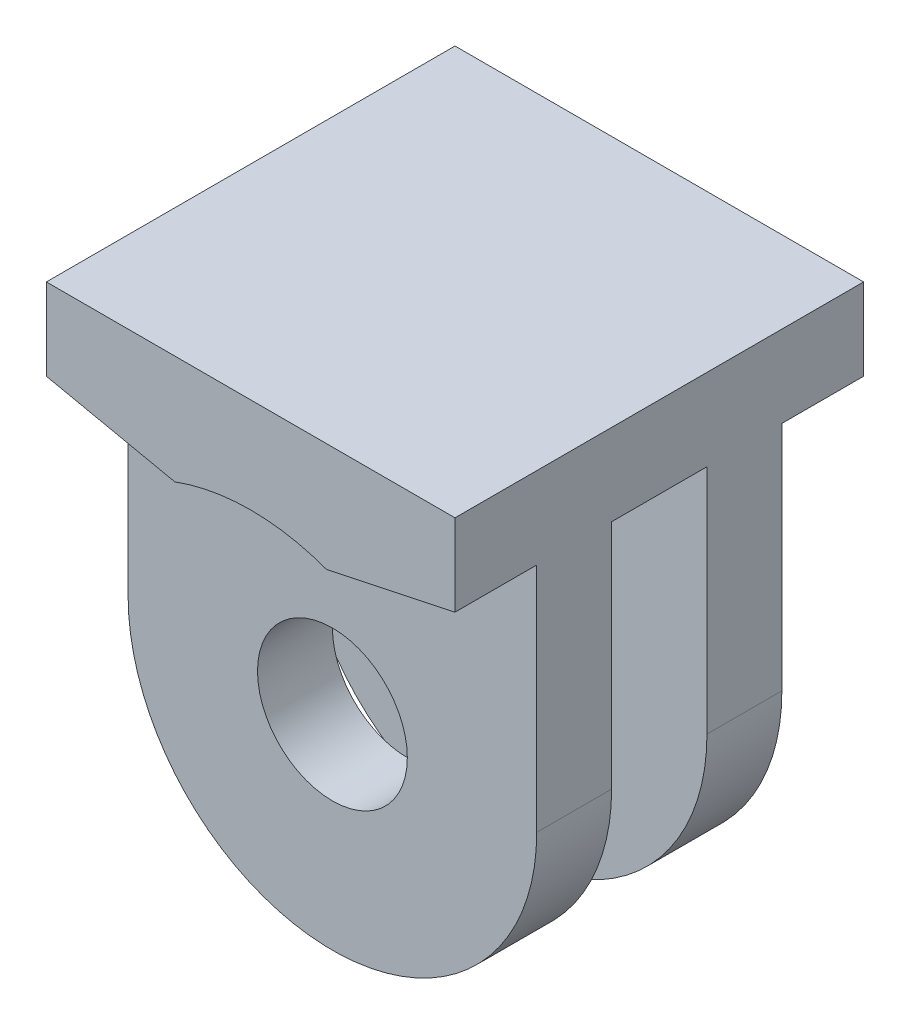
ISO-10303-21;
HEADER;
FILE_DESCRIPTION(('STEP AP214'),'2;1');
FILE_NAME('part.step','',(''),(''),'','','');
FILE_SCHEMA(('AUTOMOTIVE_DESIGN { 1 0 10303 214 1 1 1 1 }'));
ENDSEC;
DATA;
#1=APPLICATION_CONTEXT('core data for automotive mechanical design processes');
#2=APPLICATION_PROTOCOL_DEFINITION('international standard','automotive_design',2000,#1);
#3=PRODUCT_CONTEXT('',#1,'mechanical');
#4=PRODUCT('Part','Part','',(#3));
#5=PRODUCT_RELATED_PRODUCT_CATEGORY('part','',(#4));
#6=PRODUCT_DEFINITION_FORMATION('','',#4);
#7=PRODUCT_DEFINITION_CONTEXT('part definition',#1,'design');
#8=PRODUCT_DEFINITION('design','',#6,#7);
#9=PRODUCT_DEFINITION_SHAPE('','',#8);
#10=(LENGTH_UNIT() NAMED_UNIT(*) SI_UNIT(.MILLI.,.METRE.));
#11=(NAMED_UNIT(*) PLANE_ANGLE_UNIT() SI_UNIT($,.RADIAN.));
#12=(NAMED_UNIT(*) SI_UNIT($,.STERADIAN.) SOLID_ANGLE_UNIT());
#13=UNCERTAINTY_MEASURE_WITH_UNIT(LENGTH_MEASURE(1.E-05),#10,'distance_accuracy_value','');
#14=(GEOMETRIC_REPRESENTATION_CONTEXT(3) GLOBAL_UNCERTAINTY_ASSIGNED_CONTEXT((#13)) GLOBAL_UNIT_ASSIGNED_CONTEXT((#10,
#11,#12)) REPRESENTATION_CONTEXT('',''));
#15=CARTESIAN_POINT('',(0.,0.,0.));
#16=DIRECTION('',(0.,0.,1.));
#17=DIRECTION('',(1.,0.,0.));
#18=AXIS2_PLACEMENT_3D('',#15,#16,#17);
#19=CARTESIAN_POINT('',(15.,4.,0.));
#20=DIRECTION('',(-1.,0.,0.));
#21=DIRECTION('',(0.,0.,1.));
#22=AXIS2_PLACEMENT_3D('',#19,#20,#21);
#23=PLANE('',#22);
#24=DIRECTION('',(0.,0.,1.));
#25=VECTOR('',#24,1.);
#26=CARTESIAN_POINT('',(15.,1.,-6.57097161148817));
#27=LINE('',#26,#25);
#28=CARTESIAN_POINT('',(15.,1.,-1.75));
#29=VERTEX_POINT('',#28);
#30=CARTESIAN_POINT('',(15.,1.,1.75));
#31=VERTEX_POINT('',#30);
#32=EDGE_CURVE('E210',#29,#31,#27,.T.);
#33=ORIENTED_EDGE('',*,*,#32,.F.);
#34=DIRECTION('',(0.,1.,0.));
#35=VECTOR('',#34,1.);
#36=CARTESIAN_POINT('',(15.,-15.,-1.75));
#37=LINE('',#36,#35);
#38=CARTESIAN_POINT('',(15.,-7.5,-1.75));
#39=VERTEX_POINT('',#38);
#40=EDGE_CURVE('E265',#39,#29,#37,.T.);
#41=ORIENTED_EDGE('',*,*,#40,.F.);
#42=DIRECTION('',(0.,0.,-1.));
#43=VECTOR('',#42,1.);
#44=CARTESIAN_POINT('',(15.,-7.5,0.));
#45=LINE('',#44,#43);
#46=CARTESIAN_POINT('',(15.,-7.5,-4.5));
#47=VERTEX_POINT('',#46);
#48=EDGE_CURVE('E258',#39,#47,#45,.T.);
#49=ORIENTED_EDGE('',*,*,#48,.T.);
#50=DIRECTION('',(0.,1.,0.));
#51=VECTOR('',#50,1.);
#52=CARTESIAN_POINT('',(15.,-15.,-4.5));
#53=LINE('',#52,#51);
#54=CARTESIAN_POINT('',(15.,1.,-4.5));
#55=VERTEX_POINT('',#54);
#56=EDGE_CURVE('E267',#47,#55,#53,.T.);
#57=ORIENTED_EDGE('',*,*,#56,.T.);
#58=DIRECTION('',(0.,0.,-1.));
#59=VECTOR('',#58,1.);
#60=CARTESIAN_POINT('',(15.,1.,0.320971611488171));
#61=LINE('',#60,#59);
#62=CARTESIAN_POINT('',(15.,1.,-7.5));
#63=VERTEX_POINT('',#62);
#64=EDGE_CURVE('E227',#55,#63,#61,.T.);
#65=ORIENTED_EDGE('',*,*,#64,.T.);
#66=DIRECTION('',(0.,-1.,0.));
#67=VECTOR('',#66,1.);
#68=CARTESIAN_POINT('',(15.,4.,-7.5));
#69=LINE('',#68,#67);
#70=CARTESIAN_POINT('',(15.,4.,-7.5));
#71=VERTEX_POINT('',#70);
#72=EDGE_CURVE('E11',#71,#63,#69,.T.);
#73=ORIENTED_EDGE('',*,*,#72,.F.);
#74=DIRECTION('',(0.,0.,-1.));
#75=VECTOR('',#74,1.);
#76=CARTESIAN_POINT('',(15.,4.,0.));
#77=LINE('',#76,#75);
#78=CARTESIAN_POINT('',(15.,4.,7.5));
#79=VERTEX_POINT('',#78);
#80=EDGE_CURVE('E273',#79,#71,#77,.T.);
#81=ORIENTED_EDGE('',*,*,#80,.F.);
#82=DIRECTION('',(0.,-1.,0.));
#83=VECTOR('',#82,1.);
#84=CARTESIAN_POINT('',(15.,4.,7.5));
#85=LINE('',#84,#83);
#86=CARTESIAN_POINT('',(15.,1.,7.5));
#87=VERTEX_POINT('',#86);
#88=EDGE_CURVE('E207',#79,#87,#85,.T.);
#89=ORIENTED_EDGE('',*,*,#88,.T.);
#90=DIRECTION('',(0.,0.,1.));
#91=VECTOR('',#90,1.);
#92=CARTESIAN_POINT('',(15.,1.,-0.320971611488171));
#93=LINE('',#92,#91);
#94=CARTESIAN_POINT('',(15.,1.,4.5));
#95=VERTEX_POINT('',#94);
#96=EDGE_CURVE('E307',#95,#87,#93,.T.);
#97=ORIENTED_EDGE('',*,*,#96,.F.);
#98=DIRECTION('',(0.,1.,0.));
#99=VECTOR('',#98,1.);
#100=CARTESIAN_POINT('',(15.,-15.,4.5));
#101=LINE('',#100,#99);
#102=CARTESIAN_POINT('',(15.,-7.5,4.5));
#103=VERTEX_POINT('',#102);
#104=EDGE_CURVE('E190',#103,#95,#101,.T.);
#105=ORIENTED_EDGE('',*,*,#104,.F.);
#106=DIRECTION('',(0.,0.,1.));
#107=VECTOR('',#106,1.);
#108=CARTESIAN_POINT('',(15.,-7.5,0.));
#109=LINE('',#108,#107);
#110=CARTESIAN_POINT('',(15.,-7.5,1.75));
#111=VERTEX_POINT('',#110);
#112=EDGE_CURVE('E328',#111,#103,#109,.T.);
#113=ORIENTED_EDGE('',*,*,#112,.F.);
#114=DIRECTION('',(0.,1.,0.));
#115=VECTOR('',#114,1.);
#116=CARTESIAN_POINT('',(15.,-15.,1.75));
#117=LINE('',#116,#115);
#118=EDGE_CURVE('E187',#111,#31,#117,.T.);
#119=ORIENTED_EDGE('',*,*,#118,.T.);
#120=EDGE_LOOP('',(#33,#41,#49,#57,#65,#73,#81,#89,#97,#105,#113,#119));
#121=FACE_BOUND('',#120,.T.);
#122=ADVANCED_FACE('F33',(#121),#23,.F.);
#123=CARTESIAN_POINT('',(0.,4.,0.));
#124=DIRECTION('',(1.,0.,0.));
#125=DIRECTION('',(0.,0.,-1.));
#126=AXIS2_PLACEMENT_3D('',#123,#124,#125);
#127=PLANE('',#126);
#128=DIRECTION('',(0.,1.,0.));
#129=VECTOR('',#128,1.);
#130=CARTESIAN_POINT('',(0.,-15.,-1.75));
#131=LINE('',#130,#129);
#132=CARTESIAN_POINT('',(0.,-7.5,-1.75));
#133=VERTEX_POINT('',#132);
#134=CARTESIAN_POINT('',(0.,1.,-1.75));
#135=VERTEX_POINT('',#134);
#136=EDGE_CURVE('E165',#133,#135,#131,.T.);
#137=ORIENTED_EDGE('',*,*,#136,.T.);
#138=DIRECTION('',(0.,0.,1.));
#139=VECTOR('',#138,1.);
#140=CARTESIAN_POINT('',(0.,1.,-6.57097161148817));
#141=LINE('',#140,#139);
#142=CARTESIAN_POINT('',(0.,1.,1.75));
#143=VERTEX_POINT('',#142);
#144=EDGE_CURVE('E159',#135,#143,#141,.T.);
#145=ORIENTED_EDGE('',*,*,#144,.T.);
#146=DIRECTION('',(0.,1.,0.));
#147=VECTOR('',#146,1.);
#148=CARTESIAN_POINT('',(0.,-15.,1.75));
#149=LINE('',#148,#147);
#150=CARTESIAN_POINT('',(0.,-7.5,1.75));
#151=VERTEX_POINT('',#150);
#152=EDGE_CURVE('E163',#151,#143,#149,.T.);
#153=ORIENTED_EDGE('',*,*,#152,.F.);
#154=DIRECTION('',(0.,0.,1.));
#155=VECTOR('',#154,1.);
#156=CARTESIAN_POINT('',(0.,-7.5,0.));
#157=LINE('',#156,#155);
#158=CARTESIAN_POINT('',(0.,-7.5,4.5));
#159=VERTEX_POINT('',#158);
#160=EDGE_CURVE('E192',#151,#159,#157,.T.);
#161=ORIENTED_EDGE('',*,*,#160,.T.);
#162=DIRECTION('',(0.,1.,0.));
#163=VECTOR('',#162,1.);
#164=CARTESIAN_POINT('',(0.,-15.,4.5));
#165=LINE('',#164,#163);
#166=CARTESIAN_POINT('',(0.,1.,4.5));
#167=VERTEX_POINT('',#166);
#168=EDGE_CURVE('E198',#159,#167,#165,.T.);
#169=ORIENTED_EDGE('',*,*,#168,.T.);
#170=DIRECTION('',(0.,0.,1.));
#171=VECTOR('',#170,1.);
#172=CARTESIAN_POINT('',(0.,1.,-0.320971611488171));
#173=LINE('',#172,#171);
#174=CARTESIAN_POINT('',(0.,1.,7.5));
#175=VERTEX_POINT('',#174);
#176=EDGE_CURVE('E316',#167,#175,#173,.T.);
#177=ORIENTED_EDGE('',*,*,#176,.T.);
#178=DIRECTION('',(0.,-1.,0.));
#179=VECTOR('',#178,1.);
#180=CARTESIAN_POINT('',(0.,4.,7.5));
#181=LINE('',#180,#179);
#182=CARTESIAN_POINT('',(0.,4.,7.5));
#183=VERTEX_POINT('',#182);
#184=EDGE_CURVE('E204',#183,#175,#181,.T.);
#185=ORIENTED_EDGE('',*,*,#184,.F.);
#186=DIRECTION('',(0.,0.,1.));
#187=VECTOR('',#186,1.);
#188=CARTESIAN_POINT('',(0.,4.,0.));
#189=LINE('',#188,#187);
#190=CARTESIAN_POINT('',(0.,4.,-7.5));
#191=VERTEX_POINT('',#190);
#192=EDGE_CURVE('E271',#191,#183,#189,.T.);
#193=ORIENTED_EDGE('',*,*,#192,.F.);
#194=DIRECTION('',(0.,-1.,0.));
#195=VECTOR('',#194,1.);
#196=CARTESIAN_POINT('',(0.,4.,-7.5));
#197=LINE('',#196,#195);
#198=CARTESIAN_POINT('',(0.,1.,-7.5));
#199=VERTEX_POINT('',#198);
#200=EDGE_CURVE('E42',#191,#199,#197,.T.);
#201=ORIENTED_EDGE('',*,*,#200,.T.);
#202=DIRECTION('',(0.,0.,-1.));
#203=VECTOR('',#202,1.);
#204=CARTESIAN_POINT('',(0.,1.,0.320971611488171));
#205=LINE('',#204,#203);
#206=CARTESIAN_POINT('',(0.,1.,-4.5));
#207=VERTEX_POINT('',#206);
#208=EDGE_CURVE('E232',#207,#199,#205,.T.);
#209=ORIENTED_EDGE('',*,*,#208,.F.);
#210=DIRECTION('',(0.,1.,0.));
#211=VECTOR('',#210,1.);
#212=CARTESIAN_POINT('',(0.,-15.,-4.5));
#213=LINE('',#212,#211);
#214=CARTESIAN_POINT('',(0.,-7.5,-4.5));
#215=VERTEX_POINT('',#214);
#216=EDGE_CURVE('E269',#215,#207,#213,.T.);
#217=ORIENTED_EDGE('',*,*,#216,.F.);
#218=DIRECTION('',(0.,0.,-1.));
#219=VECTOR('',#218,1.);
#220=CARTESIAN_POINT('',(0.,-7.5,0.));
#221=LINE('',#220,#219);
#222=EDGE_CURVE('E259',#133,#215,#221,.T.);
#223=ORIENTED_EDGE('',*,*,#222,.F.);
#224=EDGE_LOOP('',(#137,#145,#153,#161,#169,#177,#185,#193,#201,#209,#217,#223));
#225=FACE_BOUND('',#224,.T.);
#226=ADVANCED_FACE('F35',(#225),#127,.F.);
#227=CARTESIAN_POINT('',(0.,4.,-7.5));
#228=DIRECTION('',(0.,0.,1.));
#229=DIRECTION('',(1.,0.,0.));
#230=AXIS2_PLACEMENT_3D('',#227,#228,#229);
#231=PLANE('',#230);
#232=ORIENTED_EDGE('',*,*,#72,.T.);
#233=DIRECTION('',(0.97825048530605,0.207427066696896,0.));
#234=VECTOR('',#233,1.);
#235=CARTESIAN_POINT('',(10.283882181415,0.,-7.5));
#236=LINE('',#235,#234);
#237=CARTESIAN_POINT('',(10.283882181415,0.,-7.5));
#238=VERTEX_POINT('',#237);
#239=EDGE_CURVE('E221',#238,#63,#236,.T.);
#240=ORIENTED_EDGE('',*,*,#239,.F.);
#241=CARTESIAN_POINT('',(7.5,-7.5,-7.5));
#242=DIRECTION('',(0.,0.,-1.));
#243=DIRECTION('',(-1.,0.,0.));
#244=AXIS2_PLACEMENT_3D('',#241,#242,#243);
#245=CIRCLE('',#244,8.);
#246=CARTESIAN_POINT('',(4.71611781858499,0.,-7.5));
#247=VERTEX_POINT('',#246);
#248=EDGE_CURVE('E241',#247,#238,#245,.T.);
#249=ORIENTED_EDGE('',*,*,#248,.F.);
#250=DIRECTION('',(0.97825048530605,-0.207427066696896,0.));
#251=VECTOR('',#250,1.);
#252=CARTESIAN_POINT('',(4.71611781858499,0.,-7.5));
#253=LINE('',#252,#251);
#254=EDGE_CURVE('E168',#199,#247,#253,.T.);
#255=ORIENTED_EDGE('',*,*,#254,.F.);
#256=ORIENTED_EDGE('',*,*,#200,.F.);
#257=DIRECTION('',(-1.,0.,0.));
#258=VECTOR('',#257,1.);
#259=CARTESIAN_POINT('',(0.,4.,-7.5));
#260=LINE('',#259,#258);
#261=EDGE_CURVE('E57',#71,#191,#260,.T.);
#262=ORIENTED_EDGE('',*,*,#261,.F.);
#263=EDGE_LOOP('',(#232,#240,#249,#255,#256,#262));
#264=FACE_BOUND('',#263,.T.);
#265=ADVANCED_FACE('F283',(#264),#231,.F.);
#266=CARTESIAN_POINT('',(0.,4.,0.));
#267=DIRECTION('',(0.,-1.,0.));
#268=DIRECTION('',(0.,0.,-1.));
#269=AXIS2_PLACEMENT_3D('',#266,#267,#268);
#270=PLANE('',#269);
#271=ORIENTED_EDGE('',*,*,#192,.T.);
#272=DIRECTION('',(-1.,0.,0.));
#273=VECTOR('',#272,1.);
#274=CARTESIAN_POINT('',(0.,4.,7.5));
#275=LINE('',#274,#273);
#276=EDGE_CURVE('E201',#79,#183,#275,.T.);
#277=ORIENTED_EDGE('',*,*,#276,.F.);
#278=ORIENTED_EDGE('',*,*,#80,.T.);
#279=ORIENTED_EDGE('',*,*,#261,.T.);
#280=EDGE_LOOP('',(#271,#277,#278,#279));
#281=FACE_BOUND('',#280,.T.);
#282=ADVANCED_FACE('F378',(#281),#270,.F.);
#283=CARTESIAN_POINT('',(0.,-15.,-4.5));
#284=DIRECTION('',(0.,0.,1.));
#285=DIRECTION('',(1.,0.,0.));
#286=AXIS2_PLACEMENT_3D('',#283,#284,#285);
#287=PLANE('',#286);
#288=ORIENTED_EDGE('',*,*,#216,.T.);
#289=DIRECTION('',(0.97825048530605,-0.207427066696896,0.));
#290=VECTOR('',#289,1.);
#291=CARTESIAN_POINT('',(4.71611781858499,0.,-4.5));
#292=LINE('',#291,#290);
#293=CARTESIAN_POINT('',(4.71611781858499,0.,-4.5));
#294=VERTEX_POINT('',#293);
#295=EDGE_CURVE('E224',#207,#294,#292,.T.);
#296=ORIENTED_EDGE('',*,*,#295,.T.);
#297=CARTESIAN_POINT('',(7.5,-7.5,-4.5));
#298=DIRECTION('',(0.,0.,1.));
#299=DIRECTION('',(1.,0.,0.));
#300=AXIS2_PLACEMENT_3D('',#297,#298,#299);
#301=CIRCLE('',#300,8.);
#302=CARTESIAN_POINT('',(10.283882181415,0.,-4.5));
#303=VERTEX_POINT('',#302);
#304=EDGE_CURVE('E244',#294,#303,#301,.F.);
#305=ORIENTED_EDGE('',*,*,#304,.T.);
#306=DIRECTION('',(0.97825048530605,0.207427066696896,0.));
#307=VECTOR('',#306,1.);
#308=CARTESIAN_POINT('',(10.283882181415,0.,-4.5));
#309=LINE('',#308,#307);
#310=EDGE_CURVE('E223',#303,#55,#309,.T.);
#311=ORIENTED_EDGE('',*,*,#310,.T.);
#312=ORIENTED_EDGE('',*,*,#56,.F.);
#313=CARTESIAN_POINT('',(7.5,-7.5,-4.5));
#314=DIRECTION('',(0.,0.,1.));
#315=DIRECTION('',(-1.,0.,0.));
#316=AXIS2_PLACEMENT_3D('',#313,#314,#315);
#317=CIRCLE('',#316,7.5);
#318=EDGE_CURVE('E256',#215,#47,#317,.T.);
#319=ORIENTED_EDGE('',*,*,#318,.F.);
#320=EDGE_LOOP('',(#288,#296,#305,#311,#312,#319));
#321=FACE_BOUND('',#320,.T.);
#322=CARTESIAN_POINT('',(7.5,-7.5,-4.5));
#323=DIRECTION('',(0.,0.,1.));
#324=DIRECTION('',(1.,0.,0.));
#325=AXIS2_PLACEMENT_3D('',#322,#323,#324);
#326=CIRCLE('',#325,2.75);
#327=CARTESIAN_POINT('',(10.25,-7.5,-4.5));
#328=VERTEX_POINT('',#327);
#329=EDGE_CURVE('E253',#328,#328,#326,.T.);
#330=ORIENTED_EDGE('',*,*,#329,.T.);
#331=EDGE_LOOP('',(#330));
#332=FACE_BOUND('',#331,.T.);
#333=ADVANCED_FACE('F293',(#321,#332),#287,.F.);
#334=CARTESIAN_POINT('',(0.,-15.,-1.75));
#335=DIRECTION('',(0.,0.,-1.));
#336=DIRECTION('',(-1.,0.,0.));
#337=AXIS2_PLACEMENT_3D('',#334,#335,#336);
#338=PLANE('',#337);
#339=ORIENTED_EDGE('',*,*,#40,.T.);
#340=DIRECTION('',(-0.97825048530605,-0.207427066696897,0.));
#341=VECTOR('',#340,1.);
#342=CARTESIAN_POINT('',(10.283882181415,0.,-1.75));
#343=LINE('',#342,#341);
#344=CARTESIAN_POINT('',(10.283882181415,0.,-1.75));
#345=VERTEX_POINT('',#344);
#346=EDGE_CURVE('E216',#29,#345,#343,.T.);
#347=ORIENTED_EDGE('',*,*,#346,.T.);
#348=CARTESIAN_POINT('',(7.5,-7.5,-1.75));
#349=DIRECTION('',(0.,0.,-1.));
#350=DIRECTION('',(-1.,0.,0.));
#351=AXIS2_PLACEMENT_3D('',#348,#349,#350);
#352=CIRCLE('',#351,8.);
#353=CARTESIAN_POINT('',(4.71611781858498,0.,-1.75));
#354=VERTEX_POINT('',#353);
#355=EDGE_CURVE('E230',#345,#354,#352,.F.);
#356=ORIENTED_EDGE('',*,*,#355,.T.);
#357=DIRECTION('',(-0.97825048530605,0.207427066696897,0.));
#358=VECTOR('',#357,1.);
#359=CARTESIAN_POINT('',(4.71611781858498,0.,-1.75));
#360=LINE('',#359,#358);
#361=EDGE_CURVE('E169',#354,#135,#360,.T.);
#362=ORIENTED_EDGE('',*,*,#361,.T.);
#363=ORIENTED_EDGE('',*,*,#136,.F.);
#364=CARTESIAN_POINT('',(7.5,-7.5,-1.75));
#365=DIRECTION('',(0.,0.,-1.));
#366=DIRECTION('',(-1.,0.,0.));
#367=AXIS2_PLACEMENT_3D('',#364,#365,#366);
#368=CIRCLE('',#367,7.5);
#369=EDGE_CURVE('E49',#133,#39,#368,.F.);
#370=ORIENTED_EDGE('',*,*,#369,.T.);
#371=EDGE_LOOP('',(#339,#347,#356,#362,#363,#370));
#372=FACE_BOUND('',#371,.T.);
#373=CARTESIAN_POINT('',(7.5,-7.5,-1.75));
#374=DIRECTION('',(0.,0.,-1.));
#375=DIRECTION('',(-1.,0.,0.));
#376=AXIS2_PLACEMENT_3D('',#373,#374,#375);
#377=CIRCLE('',#376,2.75);
#378=CARTESIAN_POINT('',(4.75,-7.5,-1.75));
#379=VERTEX_POINT('',#378);
#380=EDGE_CURVE('E37',#379,#379,#377,.T.);
#381=ORIENTED_EDGE('',*,*,#380,.T.);
#382=EDGE_LOOP('',(#381));
#383=FACE_BOUND('',#382,.T.);
#384=ADVANCED_FACE('F298',(#372,#383),#338,.F.);
#385=CARTESIAN_POINT('',(7.5,-7.5,0.));
#386=DIRECTION('',(0.,0.,-1.));
#387=DIRECTION('',(-1.,0.,0.));
#388=AXIS2_PLACEMENT_3D('',#385,#386,#387);
#389=CYLINDRICAL_SURFACE('',#388,7.5);
#390=ORIENTED_EDGE('',*,*,#222,.T.);
#391=ORIENTED_EDGE('',*,*,#318,.T.);
#392=ORIENTED_EDGE('',*,*,#48,.F.);
#393=ORIENTED_EDGE('',*,*,#369,.F.);
#394=EDGE_LOOP('',(#390,#391,#392,#393));
#395=FACE_BOUND('',#394,.T.);
#396=ADVANCED_FACE('F360',(#395),#389,.T.);
#397=CARTESIAN_POINT('',(7.5,-7.5,0.));
#398=DIRECTION('',(0.,0.,-1.));
#399=DIRECTION('',(-1.,0.,0.));
#400=AXIS2_PLACEMENT_3D('',#397,#398,#399);
#401=CYLINDRICAL_SURFACE('',#400,2.75);
#402=ORIENTED_EDGE('',*,*,#380,.F.);
#403=EDGE_LOOP('',(#402));
#404=FACE_BOUND('',#403,.T.);
#405=ORIENTED_EDGE('',*,*,#329,.F.);
#406=EDGE_LOOP('',(#405));
#407=FACE_BOUND('',#406,.T.);
#408=ADVANCED_FACE('F362',(#404,#407),#401,.F.);
#409=CARTESIAN_POINT('',(7.5,-7.5,18.1274169979695));
#410=DIRECTION('',(0.,0.,-1.));
#411=DIRECTION('',(-1.,0.,0.));
#412=AXIS2_PLACEMENT_3D('',#409,#410,#411);
#413=CYLINDRICAL_SURFACE('',#412,8.);
#414=DIRECTION('',(0.,0.,-1.));
#415=VECTOR('',#414,1.);
#416=CARTESIAN_POINT('',(4.71611781858499,0.,18.1274169979695));
#417=LINE('',#416,#415);
#418=EDGE_CURVE('E250',#294,#247,#417,.T.);
#419=ORIENTED_EDGE('',*,*,#418,.T.);
#420=ORIENTED_EDGE('',*,*,#248,.T.);
#421=DIRECTION('',(0.,0.,-1.));
#422=VECTOR('',#421,1.);
#423=CARTESIAN_POINT('',(10.283882181415,0.,18.1274169979695));
#424=LINE('',#423,#422);
#425=EDGE_CURVE('E247',#238,#303,#424,.F.);
#426=ORIENTED_EDGE('',*,*,#425,.T.);
#427=ORIENTED_EDGE('',*,*,#304,.F.);
#428=EDGE_LOOP('',(#419,#420,#426,#427));
#429=FACE_BOUND('',#428,.T.);
#430=ADVANCED_FACE('F291',(#429),#413,.F.);
#431=CARTESIAN_POINT('',(7.5,-7.5,-24.3774169979695));
#432=DIRECTION('',(0.,0.,1.));
#433=DIRECTION('',(1.,0.,0.));
#434=AXIS2_PLACEMENT_3D('',#431,#432,#433);
#435=CYLINDRICAL_SURFACE('',#434,8.);
#436=DIRECTION('',(0.,0.,1.));
#437=VECTOR('',#436,1.);
#438=CARTESIAN_POINT('',(10.283882181415,0.,-24.3774169979695));
#439=LINE('',#438,#437);
#440=CARTESIAN_POINT('',(10.283882181415,0.,1.75));
#441=VERTEX_POINT('',#440);
#442=EDGE_CURVE('E239',#345,#441,#439,.T.);
#443=ORIENTED_EDGE('',*,*,#442,.T.);
#444=CARTESIAN_POINT('',(7.5,-7.5,1.75));
#445=DIRECTION('',(0.,0.,-1.));
#446=DIRECTION('',(-1.,0.,0.));
#447=AXIS2_PLACEMENT_3D('',#444,#445,#446);
#448=CIRCLE('',#447,8.);
#449=CARTESIAN_POINT('',(4.71611781858498,0.,1.75));
#450=VERTEX_POINT('',#449);
#451=EDGE_CURVE('E303',#441,#450,#448,.F.);
#452=ORIENTED_EDGE('',*,*,#451,.T.);
#453=DIRECTION('',(0.,0.,1.));
#454=VECTOR('',#453,1.);
#455=CARTESIAN_POINT('',(4.71611781858498,0.,-24.3774169979695));
#456=LINE('',#455,#454);
#457=EDGE_CURVE('E175',#450,#354,#456,.F.);
#458=ORIENTED_EDGE('',*,*,#457,.T.);
#459=ORIENTED_EDGE('',*,*,#355,.F.);
#460=EDGE_LOOP('',(#443,#452,#458,#459));
#461=FACE_BOUND('',#460,.T.);
#462=ADVANCED_FACE('F302',(#461),#435,.F.);
#463=CARTESIAN_POINT('',(4.71611781858499,0.,0.320971611488171));
#464=DIRECTION('',(0.207427066696896,0.97825048530605,0.));
#465=DIRECTION('',(-0.97825048530605,0.207427066696896,0.));
#466=AXIS2_PLACEMENT_3D('',#463,#464,#465);
#467=PLANE('',#466);
#468=ORIENTED_EDGE('',*,*,#208,.T.);
#469=ORIENTED_EDGE('',*,*,#254,.T.);
#470=ORIENTED_EDGE('',*,*,#418,.F.);
#471=ORIENTED_EDGE('',*,*,#295,.F.);
#472=EDGE_LOOP('',(#468,#469,#470,#471));
#473=FACE_BOUND('',#472,.T.);
#474=ADVANCED_FACE('F287',(#473),#467,.F.);
#475=CARTESIAN_POINT('',(10.283882181415,0.,0.320971611488171));
#476=DIRECTION('',(-0.207427066696896,0.97825048530605,0.));
#477=DIRECTION('',(-0.97825048530605,-0.207427066696896,0.));
#478=AXIS2_PLACEMENT_3D('',#475,#476,#477);
#479=PLANE('',#478);
#480=ORIENTED_EDGE('',*,*,#425,.F.);
#481=ORIENTED_EDGE('',*,*,#239,.T.);
#482=ORIENTED_EDGE('',*,*,#64,.F.);
#483=ORIENTED_EDGE('',*,*,#310,.F.);
#484=EDGE_LOOP('',(#480,#481,#482,#483));
#485=FACE_BOUND('',#484,.T.);
#486=ADVANCED_FACE('F423',(#485),#479,.F.);
#487=CARTESIAN_POINT('',(10.283882181415,0.,-6.57097161148817));
#488=DIRECTION('',(-0.207427066696897,0.97825048530605,0.));
#489=DIRECTION('',(-0.97825048530605,-0.207427066696897,0.));
#490=AXIS2_PLACEMENT_3D('',#487,#488,#489);
#491=PLANE('',#490);
#492=ORIENTED_EDGE('',*,*,#32,.T.);
#493=DIRECTION('',(-0.97825048530605,-0.207427066696897,0.));
#494=VECTOR('',#493,1.);
#495=CARTESIAN_POINT('',(10.283882181415,0.,1.75));
#496=LINE('',#495,#494);
#497=EDGE_CURVE('E180',#31,#441,#496,.T.);
#498=ORIENTED_EDGE('',*,*,#497,.T.);
#499=ORIENTED_EDGE('',*,*,#442,.F.);
#500=ORIENTED_EDGE('',*,*,#346,.F.);
#501=EDGE_LOOP('',(#492,#498,#499,#500));
#502=FACE_BOUND('',#501,.T.);
#503=ADVANCED_FACE('F356',(#502),#491,.F.);
#504=CARTESIAN_POINT('',(4.71611781858498,0.,-6.57097161148817));
#505=DIRECTION('',(0.207427066696897,0.97825048530605,0.));
#506=DIRECTION('',(-0.97825048530605,0.207427066696897,0.));
#507=AXIS2_PLACEMENT_3D('',#504,#505,#506);
#508=PLANE('',#507);
#509=ORIENTED_EDGE('',*,*,#457,.F.);
#510=DIRECTION('',(-0.97825048530605,0.207427066696897,0.));
#511=VECTOR('',#510,1.);
#512=CARTESIAN_POINT('',(4.71611781858498,0.,1.75));
#513=LINE('',#512,#511);
#514=EDGE_CURVE('E172',#450,#143,#513,.T.);
#515=ORIENTED_EDGE('',*,*,#514,.T.);
#516=ORIENTED_EDGE('',*,*,#144,.F.);
#517=ORIENTED_EDGE('',*,*,#361,.F.);
#518=EDGE_LOOP('',(#509,#515,#516,#517));
#519=FACE_BOUND('',#518,.T.);
#520=ADVANCED_FACE('F173',(#519),#508,.F.);
#521=CARTESIAN_POINT('',(0.,4.,7.5));
#522=DIRECTION('',(0.,0.,-1.));
#523=DIRECTION('',(1.,0.,0.));
#524=AXIS2_PLACEMENT_3D('',#521,#522,#523);
#525=PLANE('',#524);
#526=ORIENTED_EDGE('',*,*,#88,.F.);
#527=ORIENTED_EDGE('',*,*,#276,.T.);
#528=ORIENTED_EDGE('',*,*,#184,.T.);
#529=DIRECTION('',(0.97825048530605,-0.207427066696896,0.));
#530=VECTOR('',#529,1.);
#531=CARTESIAN_POINT('',(4.71611781858499,0.,7.5));
#532=LINE('',#531,#530);
#533=CARTESIAN_POINT('',(4.71611781858499,0.,7.5));
#534=VERTEX_POINT('',#533);
#535=EDGE_CURVE('E179',#175,#534,#532,.T.);
#536=ORIENTED_EDGE('',*,*,#535,.T.);
#537=CARTESIAN_POINT('',(7.5,-7.5,7.5));
#538=DIRECTION('',(0.,0.,-1.));
#539=DIRECTION('',(-1.,0.,0.));
#540=AXIS2_PLACEMENT_3D('',#537,#538,#539);
#541=CIRCLE('',#540,8.);
#542=CARTESIAN_POINT('',(10.283882181415,0.,7.5));
#543=VERTEX_POINT('',#542);
#544=EDGE_CURVE('E306',#534,#543,#541,.T.);
#545=ORIENTED_EDGE('',*,*,#544,.T.);
#546=DIRECTION('',(0.97825048530605,0.207427066696896,0.));
#547=VECTOR('',#546,1.);
#548=CARTESIAN_POINT('',(10.283882181415,0.,7.5));
#549=LINE('',#548,#547);
#550=EDGE_CURVE('E348',#543,#87,#549,.T.);
#551=ORIENTED_EDGE('',*,*,#550,.T.);
#552=EDGE_LOOP('',(#526,#527,#528,#536,#545,#551));
#553=FACE_BOUND('',#552,.T.);
#554=ADVANCED_FACE('F434',(#553),#525,.F.);
#555=CARTESIAN_POINT('',(0.,-15.,4.5));
#556=DIRECTION('',(0.,0.,-1.));
#557=DIRECTION('',(1.,0.,0.));
#558=AXIS2_PLACEMENT_3D('',#555,#556,#557);
#559=PLANE('',#558);
#560=ORIENTED_EDGE('',*,*,#168,.F.);
#561=CARTESIAN_POINT('',(7.5,-7.5,4.5));
#562=DIRECTION('',(0.,0.,1.));
#563=DIRECTION('',(-1.,0.,0.));
#564=AXIS2_PLACEMENT_3D('',#561,#562,#563);
#565=CIRCLE('',#564,7.5);
#566=EDGE_CURVE('E326',#159,#103,#565,.T.);
#567=ORIENTED_EDGE('',*,*,#566,.T.);
#568=ORIENTED_EDGE('',*,*,#104,.T.);
#569=DIRECTION('',(0.97825048530605,0.207427066696896,0.));
#570=VECTOR('',#569,1.);
#571=CARTESIAN_POINT('',(10.283882181415,0.,4.5));
#572=LINE('',#571,#570);
#573=CARTESIAN_POINT('',(10.283882181415,0.,4.5));
#574=VERTEX_POINT('',#573);
#575=EDGE_CURVE('E313',#574,#95,#572,.T.);
#576=ORIENTED_EDGE('',*,*,#575,.F.);
#577=CARTESIAN_POINT('',(7.5,-7.5,4.5));
#578=DIRECTION('',(0.,0.,1.));
#579=DIRECTION('',(1.,0.,0.));
#580=AXIS2_PLACEMENT_3D('',#577,#578,#579);
#581=CIRCLE('',#580,8.);
#582=CARTESIAN_POINT('',(4.71611781858499,0.,4.5));
#583=VERTEX_POINT('',#582);
#584=EDGE_CURVE('E310',#583,#574,#581,.F.);
#585=ORIENTED_EDGE('',*,*,#584,.F.);
#586=DIRECTION('',(0.97825048530605,-0.207427066696896,0.));
#587=VECTOR('',#586,1.);
#588=CARTESIAN_POINT('',(4.71611781858499,0.,4.5));
#589=LINE('',#588,#587);
#590=EDGE_CURVE('E344',#167,#583,#589,.T.);
#591=ORIENTED_EDGE('',*,*,#590,.F.);
#592=EDGE_LOOP('',(#560,#567,#568,#576,#585,#591));
#593=FACE_BOUND('',#592,.T.);
#594=CARTESIAN_POINT('',(7.5,-7.5,4.5));
#595=DIRECTION('',(0.,0.,1.));
#596=DIRECTION('',(1.,0.,0.));
#597=AXIS2_PLACEMENT_3D('',#594,#595,#596);
#598=CIRCLE('',#597,2.75);
#599=CARTESIAN_POINT('',(10.25,-7.5,4.5));
#600=VERTEX_POINT('',#599);
#601=EDGE_CURVE('E214',#600,#600,#598,.T.);
#602=ORIENTED_EDGE('',*,*,#601,.F.);
#603=EDGE_LOOP('',(#602));
#604=FACE_BOUND('',#603,.T.);
#605=ADVANCED_FACE('F340',(#593,#604),#559,.F.);
#606=CARTESIAN_POINT('',(0.,-15.,1.75));
#607=DIRECTION('',(0.,0.,1.));
#608=DIRECTION('',(-1.,0.,0.));
#609=AXIS2_PLACEMENT_3D('',#606,#607,#608);
#610=PLANE('',#609);
#611=ORIENTED_EDGE('',*,*,#118,.F.);
#612=CARTESIAN_POINT('',(7.5,-7.5,1.75));
#613=DIRECTION('',(0.,0.,-1.));
#614=DIRECTION('',(-1.,0.,0.));
#615=AXIS2_PLACEMENT_3D('',#612,#613,#614);
#616=CIRCLE('',#615,7.5);
#617=EDGE_CURVE('E185',#151,#111,#616,.F.);
#618=ORIENTED_EDGE('',*,*,#617,.F.);
#619=ORIENTED_EDGE('',*,*,#152,.T.);
#620=ORIENTED_EDGE('',*,*,#514,.F.);
#621=ORIENTED_EDGE('',*,*,#451,.F.);
#622=ORIENTED_EDGE('',*,*,#497,.F.);
#623=EDGE_LOOP('',(#611,#618,#619,#620,#621,#622));
#624=FACE_BOUND('',#623,.T.);
#625=CARTESIAN_POINT('',(7.5,-7.5,1.75));
#626=DIRECTION('',(0.,0.,-1.));
#627=DIRECTION('',(-1.,0.,0.));
#628=AXIS2_PLACEMENT_3D('',#625,#626,#627);
#629=CIRCLE('',#628,2.75);
#630=CARTESIAN_POINT('',(4.75,-7.5,1.75));
#631=VERTEX_POINT('',#630);
#632=EDGE_CURVE('E211',#631,#631,#629,.T.);
#633=ORIENTED_EDGE('',*,*,#632,.F.);
#634=EDGE_LOOP('',(#633));
#635=FACE_BOUND('',#634,.T.);
#636=ADVANCED_FACE('F183',(#624,#635),#610,.F.);
#637=CARTESIAN_POINT('',(7.5,-7.5,0.));
#638=DIRECTION('',(0.,0.,1.));
#639=DIRECTION('',(-1.,0.,0.));
#640=AXIS2_PLACEMENT_3D('',#637,#638,#639);
#641=CYLINDRICAL_SURFACE('',#640,7.5);
#642=ORIENTED_EDGE('',*,*,#160,.F.);
#643=ORIENTED_EDGE('',*,*,#617,.T.);
#644=ORIENTED_EDGE('',*,*,#112,.T.);
#645=ORIENTED_EDGE('',*,*,#566,.F.);
#646=EDGE_LOOP('',(#642,#643,#644,#645));
#647=FACE_BOUND('',#646,.T.);
#648=ADVANCED_FACE('F333',(#647),#641,.T.);
#649=CARTESIAN_POINT('',(7.5,-7.5,0.));
#650=DIRECTION('',(0.,0.,1.));
#651=DIRECTION('',(-1.,0.,0.));
#652=AXIS2_PLACEMENT_3D('',#649,#650,#651);
#653=CYLINDRICAL_SURFACE('',#652,2.75);
#654=ORIENTED_EDGE('',*,*,#632,.T.);
#655=EDGE_LOOP('',(#654));
#656=FACE_BOUND('',#655,.T.);
#657=ORIENTED_EDGE('',*,*,#601,.T.);
#658=EDGE_LOOP('',(#657));
#659=FACE_BOUND('',#658,.T.);
#660=ADVANCED_FACE('F519',(#656,#659),#653,.F.);
#661=CARTESIAN_POINT('',(7.5,-7.5,-18.1274169979695));
#662=DIRECTION('',(0.,0.,1.));
#663=DIRECTION('',(-1.,0.,0.));
#664=AXIS2_PLACEMENT_3D('',#661,#662,#663);
#665=CYLINDRICAL_SURFACE('',#664,8.);
#666=DIRECTION('',(0.,0.,1.));
#667=VECTOR('',#666,1.);
#668=CARTESIAN_POINT('',(4.71611781858499,0.,-18.1274169979695));
#669=LINE('',#668,#667);
#670=EDGE_CURVE('E215',#583,#534,#669,.T.);
#671=ORIENTED_EDGE('',*,*,#670,.F.);
#672=ORIENTED_EDGE('',*,*,#584,.T.);
#673=DIRECTION('',(0.,0.,1.));
#674=VECTOR('',#673,1.);
#675=CARTESIAN_POINT('',(10.283882181415,0.,-18.1274169979695));
#676=LINE('',#675,#674);
#677=EDGE_CURVE('E321',#543,#574,#676,.F.);
#678=ORIENTED_EDGE('',*,*,#677,.F.);
#679=ORIENTED_EDGE('',*,*,#544,.F.);
#680=EDGE_LOOP('',(#671,#672,#678,#679));
#681=FACE_BOUND('',#680,.T.);
#682=ADVANCED_FACE('F528',(#681),#665,.F.);
#683=CARTESIAN_POINT('',(4.71611781858499,0.,-0.320971611488171));
#684=DIRECTION('',(0.207427066696896,0.97825048530605,0.));
#685=DIRECTION('',(-0.97825048530605,0.207427066696896,0.));
#686=AXIS2_PLACEMENT_3D('',#683,#684,#685);
#687=PLANE('',#686);
#688=ORIENTED_EDGE('',*,*,#176,.F.);
#689=ORIENTED_EDGE('',*,*,#590,.T.);
#690=ORIENTED_EDGE('',*,*,#670,.T.);
#691=ORIENTED_EDGE('',*,*,#535,.F.);
#692=EDGE_LOOP('',(#688,#689,#690,#691));
#693=FACE_BOUND('',#692,.T.);
#694=ADVANCED_FACE('F538',(#693),#687,.F.);
#695=CARTESIAN_POINT('',(10.283882181415,0.,-0.320971611488171));
#696=DIRECTION('',(-0.207427066696896,0.97825048530605,0.));
#697=DIRECTION('',(-0.97825048530605,-0.207427066696896,0.));
#698=AXIS2_PLACEMENT_3D('',#695,#696,#697);
#699=PLANE('',#698);
#700=ORIENTED_EDGE('',*,*,#677,.T.);
#701=ORIENTED_EDGE('',*,*,#575,.T.);
#702=ORIENTED_EDGE('',*,*,#96,.T.);
#703=ORIENTED_EDGE('',*,*,#550,.F.);
#704=EDGE_LOOP('',(#700,#701,#702,#703));
#705=FACE_BOUND('',#704,.T.);
#706=ADVANCED_FACE('F548',(#705),#699,.F.);
#707=CLOSED_SHELL('',(#122,#226,#265,#282,#333,#384,#396,#408,#430,#462,#474,#486,#503,#520,
#554,#605,#636,#648,#660,#682,#694,#706));
#708=MANIFOLD_SOLID_BREP('B2',#707);
#709=ADVANCED_BREP_SHAPE_REPRESENTATION('',(#18,#708),#14);
#710=SHAPE_DEFINITION_REPRESENTATION(#9,#709);
ENDSEC;
END-ISO-10303-21;
